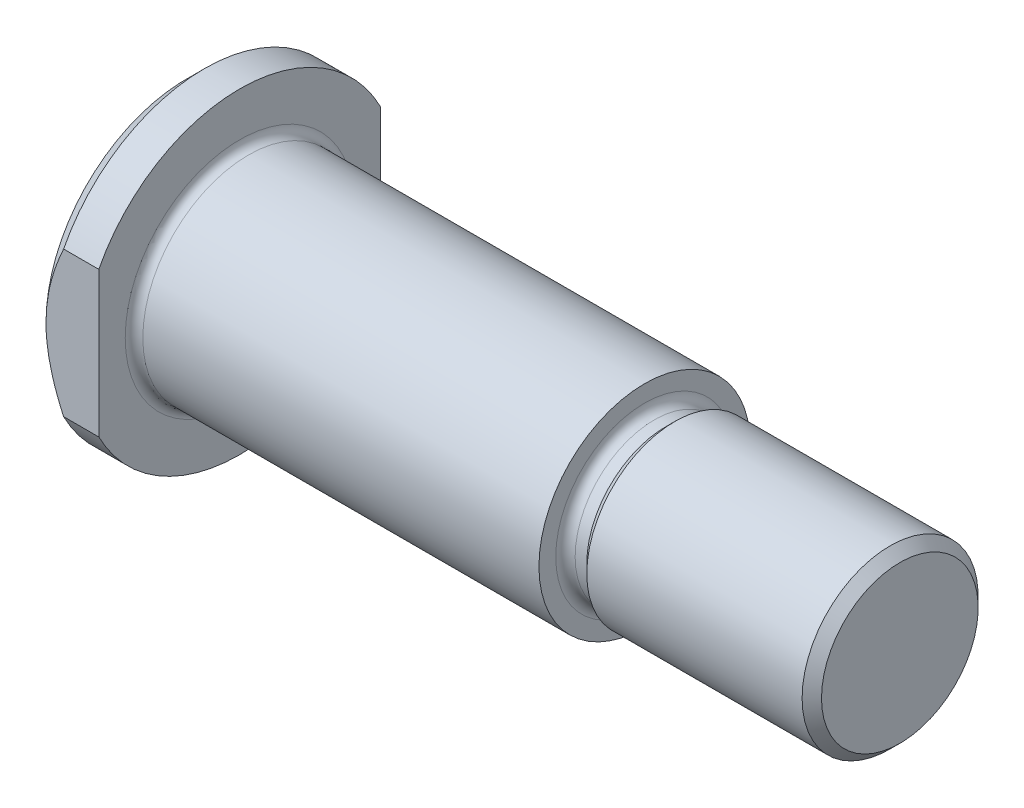
ISO-10303-21;
HEADER;
FILE_DESCRIPTION(('STEP AP214'),'2;1');
FILE_NAME('part.step','',(''),(''),'','','');
FILE_SCHEMA(('AUTOMOTIVE_DESIGN { 1 0 10303 214 1 1 1 1 }'));
ENDSEC;
DATA;
#1=APPLICATION_CONTEXT('core data for automotive mechanical design processes');
#2=APPLICATION_PROTOCOL_DEFINITION('international standard','automotive_design',2000,#1);
#3=PRODUCT_CONTEXT('',#1,'mechanical');
#4=PRODUCT('Part','Part','',(#3));
#5=PRODUCT_RELATED_PRODUCT_CATEGORY('part','',(#4));
#6=PRODUCT_DEFINITION_FORMATION('','',#4);
#7=PRODUCT_DEFINITION_CONTEXT('part definition',#1,'design');
#8=PRODUCT_DEFINITION('design','',#6,#7);
#9=PRODUCT_DEFINITION_SHAPE('','',#8);
#10=(LENGTH_UNIT() NAMED_UNIT(*) SI_UNIT(.MILLI.,.METRE.));
#11=(NAMED_UNIT(*) PLANE_ANGLE_UNIT() SI_UNIT($,.RADIAN.));
#12=(NAMED_UNIT(*) SI_UNIT($,.STERADIAN.) SOLID_ANGLE_UNIT());
#13=UNCERTAINTY_MEASURE_WITH_UNIT(LENGTH_MEASURE(1.E-05),#10,'distance_accuracy_value','');
#14=(GEOMETRIC_REPRESENTATION_CONTEXT(3) GLOBAL_UNCERTAINTY_ASSIGNED_CONTEXT((#13)) GLOBAL_UNIT_ASSIGNED_CONTEXT((#10,
#11,#12)) REPRESENTATION_CONTEXT('',''));
#15=CARTESIAN_POINT('',(0.,0.,0.));
#16=DIRECTION('',(0.,0.,1.));
#17=DIRECTION('',(1.,0.,0.));
#18=AXIS2_PLACEMENT_3D('',#15,#16,#17);
#19=CARTESIAN_POINT('',(-6.34999999999999,0.,0.));
#20=DIRECTION('',(-1.,0.,0.));
#21=DIRECTION('',(0.,0.,1.));
#22=AXIS2_PLACEMENT_3D('',#19,#20,#21);
#23=CYLINDRICAL_SURFACE('',#22,18.);
#24=DIRECTION('',(-1.,0.,0.));
#25=VECTOR('',#24,1.);
#26=CARTESIAN_POINT('',(-6.34999999999999,8.24621125123533,16.));
#27=LINE('',#26,#25);
#28=CARTESIAN_POINT('',(6.,8.24621125123533,16.));
#29=VERTEX_POINT('',#28);
#30=CARTESIAN_POINT('',(2.,8.24621125123533,16.));
#31=VERTEX_POINT('',#30);
#32=EDGE_CURVE('E83',#29,#31,#27,.T.);
#33=ORIENTED_EDGE('',*,*,#32,.F.);
#34=CARTESIAN_POINT('',(6.,0.,0.));
#35=DIRECTION('',(-1.,0.,0.));
#36=DIRECTION('',(0.,0.,1.));
#37=AXIS2_PLACEMENT_3D('',#34,#35,#36);
#38=CIRCLE('',#37,18.);
#39=CARTESIAN_POINT('',(6.,8.24621125123533,-16.));
#40=VERTEX_POINT('',#39);
#41=EDGE_CURVE('E95',#29,#40,#38,.T.);
#42=ORIENTED_EDGE('',*,*,#41,.T.);
#43=DIRECTION('',(-1.,0.,0.));
#44=VECTOR('',#43,1.);
#45=CARTESIAN_POINT('',(-6.34999999999999,8.24621125123533,-16.));
#46=LINE('',#45,#44);
#47=CARTESIAN_POINT('',(2.,8.24621125123533,-16.));
#48=VERTEX_POINT('',#47);
#49=EDGE_CURVE('E175',#48,#40,#46,.F.);
#50=ORIENTED_EDGE('',*,*,#49,.F.);
#51=CARTESIAN_POINT('',(2.,0.,0.));
#52=DIRECTION('',(-1.,0.,0.));
#53=DIRECTION('',(0.,0.,1.));
#54=AXIS2_PLACEMENT_3D('',#51,#52,#53);
#55=CIRCLE('',#54,18.);
#56=EDGE_CURVE('E97',#31,#48,#55,.T.);
#57=ORIENTED_EDGE('',*,*,#56,.F.);
#58=EDGE_LOOP('',(#33,#42,#50,#57));
#59=FACE_BOUND('',#58,.T.);
#60=ADVANCED_FACE('F34',(#59),#23,.T.);
#61=CARTESIAN_POINT('',(0.,0.,0.));
#62=DIRECTION('',(1.,0.,0.));
#63=DIRECTION('',(0.,0.,-1.));
#64=AXIS2_PLACEMENT_3D('',#61,#62,#63);
#65=CONICAL_SURFACE('',#64,16.,0.785398163397446);
#66=CARTESIAN_POINT('',(4.23631170256499,-12.3898471065372,16.));
#67=CARTESIAN_POINT('',(4.05147895663005,-12.087915809139,16.));
#68=CARTESIAN_POINT('',(3.86966755229072,-11.7841061606497,16.));
#69=CARTESIAN_POINT('',(3.51303537736646,-11.172315385676,16.));
#70=CARTESIAN_POINT('',(3.33821634029121,-10.8643332497964,16.));
#71=CARTESIAN_POINT('',(2.99588293286502,-10.2426127078323,16.));
#72=CARTESIAN_POINT('',(2.82840276833598,-9.92885539934175,16.));
#73=CARTESIAN_POINT('',(2.50276930094782,-9.29655507914322,16.));
#74=CARTESIAN_POINT('',(2.34461538958465,-8.97801238136989,16.));
#75=CARTESIAN_POINT('',(2.03589919696775,-8.32926566286771,16.));
#76=CARTESIAN_POINT('',(1.88555682104021,-7.99895624254422,16.));
#77=CARTESIAN_POINT('',(1.59771441139403,-7.33279308254059,16.));
#78=CARTESIAN_POINT('',(1.46021552396574,-6.99693885112406,16.));
#79=CARTESIAN_POINT('',(1.07025580592923,-5.98189570787508,16.));
#80=CARTESIAN_POINT('',(0.839686395251404,-5.29390269098231,16.));
#81=CARTESIAN_POINT('',(0.536854627561047,-4.19695393511483,16.));
#82=CARTESIAN_POINT('',(0.439117669036099,-3.79494869735502,16.));
#83=CARTESIAN_POINT('',(0.271263347653613,-2.98509748625247,16.));
#84=CARTESIAN_POINT('',(0.201147334007472,-2.5772512285993,16.));
#85=CARTESIAN_POINT('',(0.0916160453726892,-1.76124873233214,16.));
#86=CARTESIAN_POINT('',(0.0519236231723594,-1.35313003457701,16.));
#87=CARTESIAN_POINT('',(0.00373371244767758,-0.535035005960117,16.));
#88=CARTESIAN_POINT('',(-0.004763024529066,-0.125058630582543,16.));
#89=CARTESIAN_POINT('',(0.0110887367501639,0.765238139962216,16.));
#90=CARTESIAN_POINT('',(0.0413716156358933,1.24546215027787,16.));
#91=CARTESIAN_POINT('',(0.143735694172904,2.20143974156757,16.));
#92=CARTESIAN_POINT('',(0.215825446767599,2.67719238753499,16.));
#93=CARTESIAN_POINT('',(0.399314656399904,3.62736179862125,16.));
#94=CARTESIAN_POINT('',(0.51121168639831,4.10168125948376,16.));
#95=CARTESIAN_POINT('',(0.7691655528045,5.04072046241685,16.));
#96=CARTESIAN_POINT('',(0.915216503053523,5.50544184363813,16.));
#97=CARTESIAN_POINT('',(1.26343533313193,6.50228790676249,16.));
#98=CARTESIAN_POINT('',(1.47091462350316,7.03254392804332,16.));
#99=CARTESIAN_POINT('',(1.91796697499968,8.07946920615899,16.));
#100=CARTESIAN_POINT('',(2.15755521055308,8.59613189993448,16.));
#101=CARTESIAN_POINT('',(2.66319768624281,9.61836359187484,16.));
#102=CARTESIAN_POINT('',(2.92933668006941,10.1238903398212,16.));
#103=CARTESIAN_POINT('',(3.48220267676516,11.1233766792484,16.));
#104=CARTESIAN_POINT('',(3.76892640078585,11.6173380963692,16.));
#105=CARTESIAN_POINT('',(4.34625875576426,12.5741556179942,16.));
#106=CARTESIAN_POINT('',(4.63616885629531,13.0374353865032,16.));
#107=CARTESIAN_POINT('',(5.22843648085674,13.955993074217,16.));
#108=CARTESIAN_POINT('',(5.53079499356615,14.4112703537339,16.));
#109=CARTESIAN_POINT('',(6.14324612597389,15.3111433322441,16.));
#110=CARTESIAN_POINT('',(6.45325536707596,15.7557959127548,16.));
#111=CARTESIAN_POINT('',(6.92452438961814,16.4182167135309,16.));
#112=CARTESIAN_POINT('',(7.08263534013712,16.6382352712994,16.));
#113=CARTESIAN_POINT('',(7.40078352738664,17.0768686083435,16.));
#114=CARTESIAN_POINT('',(7.56082072397298,17.2954834167291,16.));
#115=CARTESIAN_POINT('',(7.72173860835512,17.5134486210776,16.));
#116=B_SPLINE_CURVE_WITH_KNOTS('',3,(#66,#67,#68,#69,#70,#71,#72,#73,#74,#75,#76,#77,#78,#79,
#80,#81,#82,#83,#84,#85,#86,#87,#88,#89,#90,#91,#92,#93,#94,#95,#96,#97,#98,#99,#100,#101,#102,
#103,#104,#105,#106,#107,#108,#109,#110,#111,#112,#113,#114,#115),.UNSPECIFIED.,.F.,.F.,(4,2,2,
2,2,2,2,2,2,2,2,2,2,2,2,2,2,2,2,2,2,2,2,2,4),(0.,1.06205923708433,2.12438016244667,
3.19121635288528,4.25798285895532,5.34645202221981,6.43501823948288,8.60774448421154,
9.84810200507316,11.0885201066665,12.3174995771681,13.5465086553067,14.9880626722687,
16.429911709655,17.8904558716918,19.3507485057289,21.0576172837563,22.7652955775936,
24.4786109247913,26.1916539686599,27.8309565419338,29.470389564173,31.0964272746883,
31.9092319083543,32.7220196318844),.UNSPECIFIED.);
#117=CARTESIAN_POINT('',(0.,0.,16.));
#118=VERTEX_POINT('',#117);
#119=EDGE_CURVE('E49',#31,#118,#116,.F.);
#120=ORIENTED_EDGE('',*,*,#119,.F.);
#121=ORIENTED_EDGE('',*,*,#56,.T.);
#122=CARTESIAN_POINT('',(4.236311702565,-12.3898471065372,-16.));
#123=CARTESIAN_POINT('',(4.05147895663006,-12.087915809139,-16.));
#124=CARTESIAN_POINT('',(3.86966755229072,-11.7841061606497,-16.));
#125=CARTESIAN_POINT('',(3.51303537736646,-11.172315385676,-16.));
#126=CARTESIAN_POINT('',(3.33821634029122,-10.8643332497964,-16.));
#127=CARTESIAN_POINT('',(2.99588293286503,-10.2426127078323,-16.));
#128=CARTESIAN_POINT('',(2.82840276833598,-9.92885539934175,-16.));
#129=CARTESIAN_POINT('',(2.50276930094782,-9.29655507914322,-16.));
#130=CARTESIAN_POINT('',(2.34461538958466,-8.97801238136988,-16.));
#131=CARTESIAN_POINT('',(2.03589919696775,-8.32926566286771,-16.));
#132=CARTESIAN_POINT('',(1.88555682104021,-7.99895624254422,-16.));
#133=CARTESIAN_POINT('',(1.59771441139403,-7.33279308254059,-16.));
#134=CARTESIAN_POINT('',(1.46021552396574,-6.99693885112406,-16.));
#135=CARTESIAN_POINT('',(1.07025580592923,-5.98189570787508,-16.));
#136=CARTESIAN_POINT('',(0.839686395251407,-5.29390269098231,-16.));
#137=CARTESIAN_POINT('',(0.53685462756105,-4.19695393511483,-16.));
#138=CARTESIAN_POINT('',(0.439117669036102,-3.79494869735502,-16.));
#139=CARTESIAN_POINT('',(0.271263347653616,-2.98509748625247,-16.));
#140=CARTESIAN_POINT('',(0.201147334007474,-2.5772512285993,-16.));
#141=CARTESIAN_POINT('',(0.0916160453726915,-1.76124873233213,-16.));
#142=CARTESIAN_POINT('',(0.0519236231723615,-1.353130034577,-16.));
#143=CARTESIAN_POINT('',(0.00373371244767945,-0.535035005960115,-16.));
#144=CARTESIAN_POINT('',(-0.00476302452906421,-0.125058630582541,-16.));
#145=CARTESIAN_POINT('',(0.0110887367501654,0.765238139962217,-16.));
#146=CARTESIAN_POINT('',(0.0413716156358945,1.24546215027787,-16.));
#147=CARTESIAN_POINT('',(0.143735694172905,2.20143974156757,-16.));
#148=CARTESIAN_POINT('',(0.2158254467676,2.67719238753499,-16.));
#149=CARTESIAN_POINT('',(0.399314656399904,3.62736179862125,-16.));
#150=CARTESIAN_POINT('',(0.511211686398311,4.10168125948376,-16.));
#151=CARTESIAN_POINT('',(0.7691655528045,5.04072046241685,-16.));
#152=CARTESIAN_POINT('',(0.915216503053523,5.50544184363813,-16.));
#153=CARTESIAN_POINT('',(1.26343533313193,6.50228790676249,-16.));
#154=CARTESIAN_POINT('',(1.47091462350316,7.03254392804332,-16.));
#155=CARTESIAN_POINT('',(1.91796697499968,8.07946920615899,-16.));
#156=CARTESIAN_POINT('',(2.15755521055308,8.59613189993448,-16.));
#157=CARTESIAN_POINT('',(2.6631976862428,9.61836359187484,-16.));
#158=CARTESIAN_POINT('',(2.9293366800694,10.1238903398212,-16.));
#159=CARTESIAN_POINT('',(3.48220267676516,11.1233766792484,-16.));
#160=CARTESIAN_POINT('',(3.76892640078584,11.6173380963692,-16.));
#161=CARTESIAN_POINT('',(4.34625875576426,12.5741556179942,-16.));
#162=CARTESIAN_POINT('',(4.63616885629531,13.0374353865031,-16.));
#163=CARTESIAN_POINT('',(5.22843648085673,13.955993074217,-16.));
#164=CARTESIAN_POINT('',(5.53079499356615,14.4112703537339,-16.));
#165=CARTESIAN_POINT('',(6.14324612597388,15.3111433322441,-16.));
#166=CARTESIAN_POINT('',(6.45325536707596,15.7557959127548,-16.));
#167=CARTESIAN_POINT('',(6.92452438961813,16.4182167135309,-16.));
#168=CARTESIAN_POINT('',(7.08263534013712,16.6382352712994,-16.));
#169=CARTESIAN_POINT('',(7.40078352738663,17.0768686083435,-16.));
#170=CARTESIAN_POINT('',(7.56082072397297,17.2954834167291,-16.));
#171=CARTESIAN_POINT('',(7.72173860835512,17.5134486210776,-16.));
#172=B_SPLINE_CURVE_WITH_KNOTS('',3,(#122,#123,#124,#125,#126,#127,#128,#129,#130,#131,#132,
#133,#134,#135,#136,#137,#138,#139,#140,#141,#142,#143,#144,#145,#146,#147,#148,#149,#150,#151,
#152,#153,#154,#155,#156,#157,#158,#159,#160,#161,#162,#163,#164,#165,#166,#167,#168,#169,#170,
#171),.UNSPECIFIED.,.F.,.F.,(4,2,2,2,2,2,2,2,2,2,2,2,2,2,2,2,2,2,2,2,2,2,2,2,4),(0.,
1.06205923708433,2.12438016244668,3.19121635288528,4.25798285895533,5.34645202221981,
6.43501823948289,8.60774448421154,9.84810200507317,11.0885201066665,12.3174995771681,
13.5465086553067,14.9880626722687,16.429911709655,17.8904558716918,19.3507485057289,
21.0576172837563,22.7652955775936,24.4786109247913,26.1916539686599,27.8309565419338,
29.470389564173,31.0964272746883,31.9092319083543,32.7220196318844),.UNSPECIFIED.);
#173=CARTESIAN_POINT('',(0.,0.,-16.));
#174=VERTEX_POINT('',#173);
#175=EDGE_CURVE('E173',#174,#48,#172,.T.);
#176=ORIENTED_EDGE('',*,*,#175,.F.);
#177=CARTESIAN_POINT('',(0.,0.,0.));
#178=DIRECTION('',(-1.,0.,0.));
#179=DIRECTION('',(0.,0.,1.));
#180=AXIS2_PLACEMENT_3D('',#177,#178,#179);
#181=CIRCLE('',#180,16.);
#182=EDGE_CURVE('E56',#118,#174,#181,.T.);
#183=ORIENTED_EDGE('',*,*,#182,.F.);
#184=EDGE_LOOP('',(#120,#121,#176,#183));
#185=FACE_BOUND('',#184,.T.);
#186=ADVANCED_FACE('F142',(#185),#65,.T.);
#187=CARTESIAN_POINT('',(81.,8.89850000000001,0.));
#188=DIRECTION('',(1.,0.,0.));
#189=DIRECTION('',(0.,0.,-1.));
#190=AXIS2_PLACEMENT_3D('',#187,#188,#189);
#191=PLANE('',#190);
#192=CARTESIAN_POINT('',(81.,0.,0.));
#193=DIRECTION('',(-1.,0.,0.));
#194=DIRECTION('',(0.,0.,1.));
#195=AXIS2_PLACEMENT_3D('',#192,#193,#194);
#196=CIRCLE('',#195,8.89850000000001);
#197=CARTESIAN_POINT('',(81.,0.,8.89850000000001));
#198=VERTEX_POINT('',#197);
#199=EDGE_CURVE('E127',#198,#198,#196,.T.);
#200=ORIENTED_EDGE('',*,*,#199,.F.);
#201=EDGE_LOOP('',(#200));
#202=FACE_BOUND('',#201,.T.);
#203=ADVANCED_FACE('F148',(#202),#191,.T.);
#204=CARTESIAN_POINT('',(79.8985,0.,0.));
#205=DIRECTION('',(-1.,0.,0.));
#206=DIRECTION('',(0.,0.,1.));
#207=AXIS2_PLACEMENT_3D('',#204,#205,#206);
#208=CONICAL_SURFACE('',#207,10.,0.785398163397442);
#209=ORIENTED_EDGE('',*,*,#199,.T.);
#210=EDGE_LOOP('',(#209));
#211=FACE_BOUND('',#210,.T.);
#212=CARTESIAN_POINT('',(79.8985,0.,0.));
#213=DIRECTION('',(-1.,0.,0.));
#214=DIRECTION('',(0.,0.,1.));
#215=AXIS2_PLACEMENT_3D('',#212,#213,#214);
#216=CIRCLE('',#215,10.);
#217=CARTESIAN_POINT('',(79.8985,0.,10.));
#218=VERTEX_POINT('',#217);
#219=EDGE_CURVE('E124',#218,#218,#216,.T.);
#220=ORIENTED_EDGE('',*,*,#219,.F.);
#221=EDGE_LOOP('',(#220));
#222=FACE_BOUND('',#221,.T.);
#223=ADVANCED_FACE('F296',(#211,#222),#208,.T.);
#224=CARTESIAN_POINT('',(-6.34999999999999,0.,0.));
#225=DIRECTION('',(-1.,0.,0.));
#226=DIRECTION('',(0.,0.,1.));
#227=AXIS2_PLACEMENT_3D('',#224,#225,#226);
#228=CYLINDRICAL_SURFACE('',#227,10.);
#229=ORIENTED_EDGE('',*,*,#219,.T.);
#230=EDGE_LOOP('',(#229));
#231=FACE_BOUND('',#230,.T.);
#232=CARTESIAN_POINT('',(55.435815,0.,0.));
#233=DIRECTION('',(-1.,0.,0.));
#234=DIRECTION('',(0.,0.,1.));
#235=AXIS2_PLACEMENT_3D('',#232,#233,#234);
#236=CIRCLE('',#235,10.);
#237=CARTESIAN_POINT('',(55.435815,0.,10.));
#238=VERTEX_POINT('',#237);
#239=EDGE_CURVE('E121',#238,#238,#236,.T.);
#240=ORIENTED_EDGE('',*,*,#239,.F.);
#241=EDGE_LOOP('',(#240));
#242=FACE_BOUND('',#241,.T.);
#243=ADVANCED_FACE('F285',(#231,#242),#228,.T.);
#244=CARTESIAN_POINT('',(54.4233,0.,0.));
#245=DIRECTION('',(1.,0.,0.));
#246=DIRECTION('',(0.,0.,-1.));
#247=AXIS2_PLACEMENT_3D('',#244,#245,#246);
#248=CONICAL_SURFACE('',#247,8.987485,0.785398163397453);
#249=ORIENTED_EDGE('',*,*,#239,.T.);
#250=EDGE_LOOP('',(#249));
#251=FACE_BOUND('',#250,.T.);
#252=CARTESIAN_POINT('',(54.4233,0.,0.));
#253=DIRECTION('',(-1.,0.,0.));
#254=DIRECTION('',(0.,0.,1.));
#255=AXIS2_PLACEMENT_3D('',#252,#253,#254);
#256=CIRCLE('',#255,8.987485);
#257=CARTESIAN_POINT('',(54.4233,0.,8.987485));
#258=VERTEX_POINT('',#257);
#259=EDGE_CURVE('E118',#258,#258,#256,.T.);
#260=ORIENTED_EDGE('',*,*,#259,.F.);
#261=EDGE_LOOP('',(#260));
#262=FACE_BOUND('',#261,.T.);
#263=ADVANCED_FACE('F275',(#251,#262),#248,.T.);
#264=CARTESIAN_POINT('',(-6.34999999999999,0.,0.));
#265=DIRECTION('',(-1.,0.,0.));
#266=DIRECTION('',(0.,0.,1.));
#267=AXIS2_PLACEMENT_3D('',#264,#265,#266);
#268=CYLINDRICAL_SURFACE('',#267,8.987485);
#269=ORIENTED_EDGE('',*,*,#259,.T.);
#270=EDGE_LOOP('',(#269));
#271=FACE_BOUND('',#270,.T.);
#272=CARTESIAN_POINT('',(53.1015,0.,0.));
#273=DIRECTION('',(-1.,0.,0.));
#274=DIRECTION('',(0.,0.,1.));
#275=AXIS2_PLACEMENT_3D('',#272,#273,#274);
#276=CIRCLE('',#275,8.987485);
#277=CARTESIAN_POINT('',(53.1015,0.,8.987485));
#278=VERTEX_POINT('',#277);
#279=EDGE_CURVE('E115',#278,#278,#276,.T.);
#280=ORIENTED_EDGE('',*,*,#279,.F.);
#281=EDGE_LOOP('',(#280));
#282=FACE_BOUND('',#281,.T.);
#283=ADVANCED_FACE('F265',(#271,#282),#268,.T.);
#284=CARTESIAN_POINT('',(53.1015,0.,0.));
#285=DIRECTION('',(-1.,0.,0.));
#286=DIRECTION('',(0.,0.,1.));
#287=AXIS2_PLACEMENT_3D('',#284,#285,#286);
#288=TOROIDAL_SURFACE('',#287,10.088985,1.1015);
#289=ORIENTED_EDGE('',*,*,#279,.T.);
#290=EDGE_LOOP('',(#289));
#291=FACE_BOUND('',#290,.T.);
#292=CARTESIAN_POINT('',(52.,0.,0.));
#293=DIRECTION('',(-1.,0.,0.));
#294=DIRECTION('',(0.,0.,1.));
#295=AXIS2_PLACEMENT_3D('',#292,#293,#294);
#296=CIRCLE('',#295,10.088985);
#297=CARTESIAN_POINT('',(52.,0.,10.088985));
#298=VERTEX_POINT('',#297);
#299=EDGE_CURVE('E112',#298,#298,#296,.T.);
#300=ORIENTED_EDGE('',*,*,#299,.F.);
#301=EDGE_LOOP('',(#300));
#302=FACE_BOUND('',#301,.T.);
#303=ADVANCED_FACE('F255',(#291,#302),#288,.F.);
#304=CARTESIAN_POINT('',(52.,12.,0.));
#305=DIRECTION('',(1.,0.,0.));
#306=DIRECTION('',(0.,0.,-1.));
#307=AXIS2_PLACEMENT_3D('',#304,#305,#306);
#308=PLANE('',#307);
#309=ORIENTED_EDGE('',*,*,#299,.T.);
#310=EDGE_LOOP('',(#309));
#311=FACE_BOUND('',#310,.T.);
#312=CARTESIAN_POINT('',(52.,0.,0.));
#313=DIRECTION('',(-1.,0.,0.));
#314=DIRECTION('',(0.,0.,1.));
#315=AXIS2_PLACEMENT_3D('',#312,#313,#314);
#316=CIRCLE('',#315,12.);
#317=CARTESIAN_POINT('',(52.,0.,12.));
#318=VERTEX_POINT('',#317);
#319=EDGE_CURVE('E105',#318,#318,#316,.T.);
#320=ORIENTED_EDGE('',*,*,#319,.F.);
#321=EDGE_LOOP('',(#320));
#322=FACE_BOUND('',#321,.T.);
#323=ADVANCED_FACE('F215',(#311,#322),#308,.T.);
#324=CARTESIAN_POINT('',(-6.34999999999999,0.,0.));
#325=DIRECTION('',(-1.,0.,0.));
#326=DIRECTION('',(0.,0.,1.));
#327=AXIS2_PLACEMENT_3D('',#324,#325,#326);
#328=CYLINDRICAL_SURFACE('',#327,12.);
#329=CARTESIAN_POINT('',(7.,0.,0.));
#330=DIRECTION('',(1.,0.,0.));
#331=DIRECTION('',(0.,0.,-1.));
#332=AXIS2_PLACEMENT_3D('',#329,#330,#331);
#333=CIRCLE('',#332,12.);
#334=CARTESIAN_POINT('',(7.,0.,-12.));
#335=VERTEX_POINT('',#334);
#336=EDGE_CURVE('E11',#335,#335,#333,.T.);
#337=ORIENTED_EDGE('',*,*,#336,.T.);
#338=EDGE_LOOP('',(#337));
#339=FACE_BOUND('',#338,.T.);
#340=ORIENTED_EDGE('',*,*,#319,.T.);
#341=EDGE_LOOP('',(#340));
#342=FACE_BOUND('',#341,.T.);
#343=ADVANCED_FACE('F161',(#339,#342),#328,.T.);
#344=CARTESIAN_POINT('',(6.,18.,0.));
#345=DIRECTION('',(1.,0.,0.));
#346=DIRECTION('',(0.,0.,-1.));
#347=AXIS2_PLACEMENT_3D('',#344,#345,#346);
#348=PLANE('',#347);
#349=CARTESIAN_POINT('',(6.,0.,0.));
#350=DIRECTION('',(1.,0.,0.));
#351=DIRECTION('',(0.,0.,-1.));
#352=AXIS2_PLACEMENT_3D('',#349,#350,#351);
#353=CIRCLE('',#352,13.);
#354=CARTESIAN_POINT('',(6.,0.,-13.));
#355=VERTEX_POINT('',#354);
#356=EDGE_CURVE('E42',#355,#355,#353,.F.);
#357=ORIENTED_EDGE('',*,*,#356,.T.);
#358=EDGE_LOOP('',(#357));
#359=FACE_BOUND('',#358,.T.);
#360=DIRECTION('',(0.,-1.,0.));
#361=VECTOR('',#360,1.);
#362=CARTESIAN_POINT('',(6.,-18.,16.));
#363=LINE('',#362,#361);
#364=CARTESIAN_POINT('',(6.,-8.24621125123534,16.));
#365=VERTEX_POINT('',#364);
#366=EDGE_CURVE('E80',#29,#365,#363,.T.);
#367=ORIENTED_EDGE('',*,*,#366,.T.);
#368=CARTESIAN_POINT('',(6.,-8.24621125123533,-16.));
#369=VERTEX_POINT('',#368);
#370=EDGE_CURVE('E102',#369,#365,#38,.T.);
#371=ORIENTED_EDGE('',*,*,#370,.F.);
#372=DIRECTION('',(0.,1.,0.));
#373=VECTOR('',#372,1.);
#374=CARTESIAN_POINT('',(6.,-18.,-16.));
#375=LINE('',#374,#373);
#376=EDGE_CURVE('E101',#369,#40,#375,.T.);
#377=ORIENTED_EDGE('',*,*,#376,.T.);
#378=ORIENTED_EDGE('',*,*,#41,.F.);
#379=EDGE_LOOP('',(#367,#371,#377,#378));
#380=FACE_BOUND('',#379,.T.);
#381=ADVANCED_FACE('F100',(#359,#380),#348,.T.);
#382=DIRECTION('',(-1.,0.,0.));
#383=VECTOR('',#382,1.);
#384=CARTESIAN_POINT('',(-6.34999999999999,-8.24621125123534,16.));
#385=LINE('',#384,#383);
#386=CARTESIAN_POINT('',(2.,-8.24621125123534,16.));
#387=VERTEX_POINT('',#386);
#388=EDGE_CURVE('E85',#387,#365,#385,.F.);
#389=ORIENTED_EDGE('',*,*,#388,.F.);
#390=CARTESIAN_POINT('',(2.,-8.24621125123533,-16.));
#391=VERTEX_POINT('',#390);
#392=EDGE_CURVE('E103',#391,#387,#55,.T.);
#393=ORIENTED_EDGE('',*,*,#392,.F.);
#394=DIRECTION('',(-1.,0.,0.));
#395=VECTOR('',#394,1.);
#396=CARTESIAN_POINT('',(-6.34999999999999,-8.24621125123533,-16.));
#397=LINE('',#396,#395);
#398=EDGE_CURVE('E172',#369,#391,#397,.T.);
#399=ORIENTED_EDGE('',*,*,#398,.F.);
#400=ORIENTED_EDGE('',*,*,#370,.T.);
#401=EDGE_LOOP('',(#389,#393,#399,#400));
#402=FACE_BOUND('',#401,.T.);
#403=ADVANCED_FACE('F144',(#402),#23,.T.);
#404=EDGE_CURVE('E90',#118,#387,#116,.F.);
#405=ORIENTED_EDGE('',*,*,#404,.F.);
#406=EDGE_CURVE('E168',#174,#118,#181,.T.);
#407=ORIENTED_EDGE('',*,*,#406,.F.);
#408=EDGE_CURVE('E167',#391,#174,#172,.T.);
#409=ORIENTED_EDGE('',*,*,#408,.F.);
#410=ORIENTED_EDGE('',*,*,#392,.T.);
#411=EDGE_LOOP('',(#405,#407,#409,#410));
#412=FACE_BOUND('',#411,.T.);
#413=ADVANCED_FACE('F151',(#412),#65,.T.);
#414=CARTESIAN_POINT('',(0.,0.,0.));
#415=DIRECTION('',(-1.,0.,0.));
#416=DIRECTION('',(0.,0.,1.));
#417=AXIS2_PLACEMENT_3D('',#414,#415,#416);
#418=PLANE('',#417);
#419=ORIENTED_EDGE('',*,*,#406,.T.);
#420=ORIENTED_EDGE('',*,*,#182,.T.);
#421=EDGE_LOOP('',(#419,#420));
#422=FACE_BOUND('',#421,.T.);
#423=ADVANCED_FACE('F159',(#422),#418,.T.);
#424=CARTESIAN_POINT('',(42.0555127546399,-18.,-16.));
#425=DIRECTION('',(0.,0.,1.));
#426=DIRECTION('',(0.,-1.,0.));
#427=AXIS2_PLACEMENT_3D('',#424,#425,#426);
#428=PLANE('',#427);
#429=ORIENTED_EDGE('',*,*,#49,.T.);
#430=ORIENTED_EDGE('',*,*,#376,.F.);
#431=ORIENTED_EDGE('',*,*,#398,.T.);
#432=ORIENTED_EDGE('',*,*,#408,.T.);
#433=ORIENTED_EDGE('',*,*,#175,.T.);
#434=EDGE_LOOP('',(#429,#430,#431,#432,#433));
#435=FACE_BOUND('',#434,.T.);
#436=ADVANCED_FACE('F138',(#435),#428,.F.);
#437=CARTESIAN_POINT('',(42.0555127546399,-18.,16.));
#438=DIRECTION('',(0.,0.,-1.));
#439=DIRECTION('',(0.,1.,0.));
#440=AXIS2_PLACEMENT_3D('',#437,#438,#439);
#441=PLANE('',#440);
#442=ORIENTED_EDGE('',*,*,#388,.T.);
#443=ORIENTED_EDGE('',*,*,#366,.F.);
#444=ORIENTED_EDGE('',*,*,#32,.T.);
#445=ORIENTED_EDGE('',*,*,#119,.T.);
#446=ORIENTED_EDGE('',*,*,#404,.T.);
#447=EDGE_LOOP('',(#442,#443,#444,#445,#446));
#448=FACE_BOUND('',#447,.T.);
#449=ADVANCED_FACE('F82',(#448),#441,.F.);
#450=CARTESIAN_POINT('',(7.,0.,0.));
#451=DIRECTION('',(1.,0.,0.));
#452=DIRECTION('',(0.,0.,-1.));
#453=AXIS2_PLACEMENT_3D('',#450,#451,#452);
#454=TOROIDAL_SURFACE('',#453,13.,1.);
#455=ORIENTED_EDGE('',*,*,#336,.F.);
#456=EDGE_LOOP('',(#455));
#457=FACE_BOUND('',#456,.T.);
#458=ORIENTED_EDGE('',*,*,#356,.F.);
#459=EDGE_LOOP('',(#458));
#460=FACE_BOUND('',#459,.T.);
#461=ADVANCED_FACE('F36',(#457,#460),#454,.F.);
#462=CLOSED_SHELL('',(#60,#186,#203,#223,#243,#263,#283,#303,#323,#343,#381,#403,#413,#423,#436,
#449,#461));
#463=MANIFOLD_SOLID_BREP('B2',#462);
#464=ADVANCED_BREP_SHAPE_REPRESENTATION('',(#18,#463),#14);
#465=SHAPE_DEFINITION_REPRESENTATION(#9,#464);
ENDSEC;
END-ISO-10303-21;
